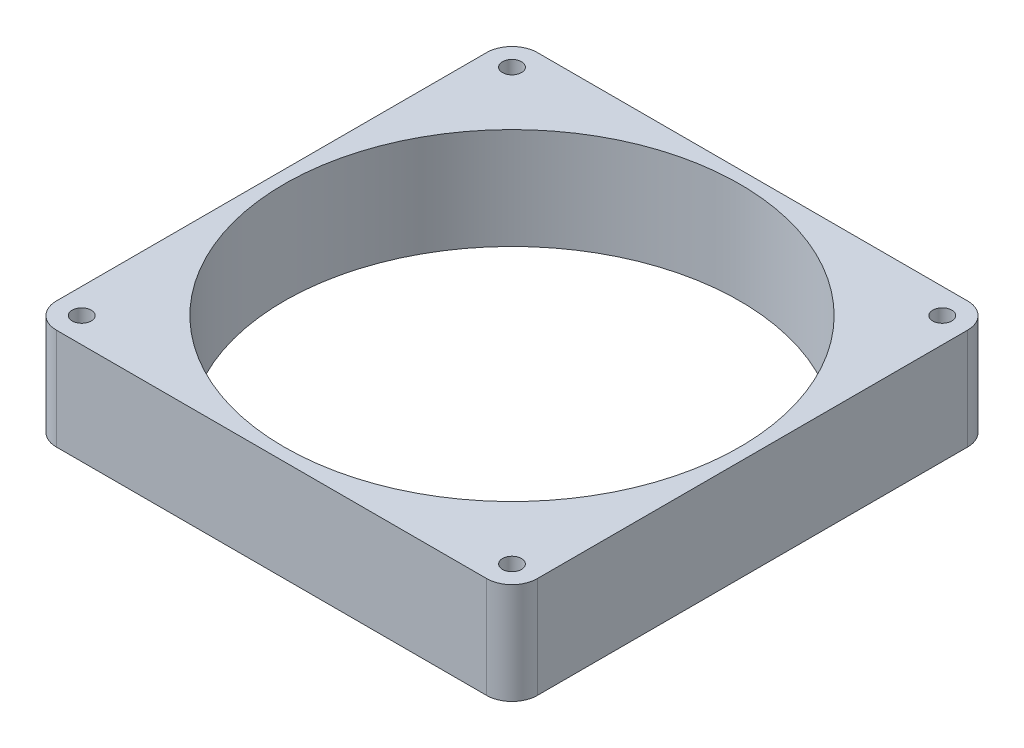
ISO-10303-21;
HEADER;
FILE_DESCRIPTION(('STEP AP214'),'2;1');
FILE_NAME('part.step','',(''),(''),'','','');
FILE_SCHEMA(('AUTOMOTIVE_DESIGN { 1 0 10303 214 1 1 1 1 }'));
ENDSEC;
DATA;
#1=APPLICATION_CONTEXT('core data for automotive mechanical design processes');
#2=APPLICATION_PROTOCOL_DEFINITION('international standard','automotive_design',2000,#1);
#3=PRODUCT_CONTEXT('',#1,'mechanical');
#4=PRODUCT('Part','Part','',(#3));
#5=PRODUCT_RELATED_PRODUCT_CATEGORY('part','',(#4));
#6=PRODUCT_DEFINITION_FORMATION('','',#4);
#7=PRODUCT_DEFINITION_CONTEXT('part definition',#1,'design');
#8=PRODUCT_DEFINITION('design','',#6,#7);
#9=PRODUCT_DEFINITION_SHAPE('','',#8);
#10=(LENGTH_UNIT() NAMED_UNIT(*) SI_UNIT(.MILLI.,.METRE.));
#11=(NAMED_UNIT(*) PLANE_ANGLE_UNIT() SI_UNIT($,.RADIAN.));
#12=(NAMED_UNIT(*) SI_UNIT($,.STERADIAN.) SOLID_ANGLE_UNIT());
#13=UNCERTAINTY_MEASURE_WITH_UNIT(LENGTH_MEASURE(1.E-05),#10,'distance_accuracy_value','');
#14=(GEOMETRIC_REPRESENTATION_CONTEXT(3) GLOBAL_UNCERTAINTY_ASSIGNED_CONTEXT((#13)) GLOBAL_UNIT_ASSIGNED_CONTEXT((#10,
#11,#12)) REPRESENTATION_CONTEXT('',''));
#15=CARTESIAN_POINT('',(0.,0.,0.));
#16=DIRECTION('',(0.,0.,1.));
#17=DIRECTION('',(1.,0.,0.));
#18=AXIS2_PLACEMENT_3D('',#15,#16,#17);
#19=CARTESIAN_POINT('',(-32.5911688311688,25.4,-19.8994155844156));
#20=DIRECTION('',(1.,0.,0.));
#21=DIRECTION('',(0.,0.,-1.));
#22=AXIS2_PLACEMENT_3D('',#19,#20,#21);
#23=PLANE('',#22);
#24=DIRECTION('',(0.,0.,1.));
#25=VECTOR('',#24,1.);
#26=CARTESIAN_POINT('',(-32.5911688311688,25.4,-19.8994155844156));
#27=LINE('',#26,#25);
#28=CARTESIAN_POINT('',(-32.5911688311688,25.4,-13.5494155844156));
#29=VERTEX_POINT('',#28);
#30=CARTESIAN_POINT('',(-32.5911688311688,25.4,94.4005844155844));
#31=VERTEX_POINT('',#30);
#32=EDGE_CURVE('E132',#29,#31,#27,.T.);
#33=ORIENTED_EDGE('',*,*,#32,.F.);
#34=DIRECTION('',(0.,-1.,0.));
#35=VECTOR('',#34,1.);
#36=CARTESIAN_POINT('',(-32.5911688311688,25.4,-13.5494155844156));
#37=LINE('',#36,#35);
#38=CARTESIAN_POINT('',(-32.5911688311688,0.,-13.5494155844156));
#39=VERTEX_POINT('',#38);
#40=EDGE_CURVE('E137',#29,#39,#37,.T.);
#41=ORIENTED_EDGE('',*,*,#40,.T.);
#42=DIRECTION('',(0.,0.,1.));
#43=VECTOR('',#42,1.);
#44=CARTESIAN_POINT('',(-32.5911688311688,0.,-19.8994155844156));
#45=LINE('',#44,#43);
#46=CARTESIAN_POINT('',(-32.5911688311688,0.,94.4005844155844));
#47=VERTEX_POINT('',#46);
#48=EDGE_CURVE('E123',#39,#47,#45,.T.);
#49=ORIENTED_EDGE('',*,*,#48,.T.);
#50=DIRECTION('',(0.,-1.,0.));
#51=VECTOR('',#50,1.);
#52=CARTESIAN_POINT('',(-32.5911688311688,25.4,94.4005844155844));
#53=LINE('',#52,#51);
#54=EDGE_CURVE('E105',#47,#31,#53,.F.);
#55=ORIENTED_EDGE('',*,*,#54,.T.);
#56=EDGE_LOOP('',(#33,#41,#49,#55));
#57=FACE_BOUND('',#56,.T.);
#58=ADVANCED_FACE('F33',(#57),#23,.F.);
#59=CARTESIAN_POINT('',(-32.5911688311688,25.4,100.750584415584));
#60=DIRECTION('',(0.,0.,-1.));
#61=DIRECTION('',(-1.,0.,0.));
#62=AXIS2_PLACEMENT_3D('',#59,#60,#61);
#63=PLANE('',#62);
#64=DIRECTION('',(1.,0.,0.));
#65=VECTOR('',#64,1.);
#66=CARTESIAN_POINT('',(-32.5911688311688,0.,100.750584415584));
#67=LINE('',#66,#65);
#68=CARTESIAN_POINT('',(-26.2411688311688,0.,100.750584415584));
#69=VERTEX_POINT('',#68);
#70=CARTESIAN_POINT('',(81.7088311688312,0.,100.750584415584));
#71=VERTEX_POINT('',#70);
#72=EDGE_CURVE('E114',#69,#71,#67,.T.);
#73=ORIENTED_EDGE('',*,*,#72,.T.);
#74=DIRECTION('',(0.,-1.,0.));
#75=VECTOR('',#74,1.);
#76=CARTESIAN_POINT('',(81.7088311688312,25.4,100.750584415584));
#77=LINE('',#76,#75);
#78=CARTESIAN_POINT('',(81.7088311688312,25.4,100.750584415584));
#79=VERTEX_POINT('',#78);
#80=EDGE_CURVE('E11',#71,#79,#77,.F.);
#81=ORIENTED_EDGE('',*,*,#80,.T.);
#82=DIRECTION('',(1.,0.,0.));
#83=VECTOR('',#82,1.);
#84=CARTESIAN_POINT('',(-32.5911688311688,25.4,100.750584415584));
#85=LINE('',#84,#83);
#86=CARTESIAN_POINT('',(-26.2411688311688,25.4,100.750584415584));
#87=VERTEX_POINT('',#86);
#88=EDGE_CURVE('E116',#87,#79,#85,.T.);
#89=ORIENTED_EDGE('',*,*,#88,.F.);
#90=DIRECTION('',(0.,-1.,0.));
#91=VECTOR('',#90,1.);
#92=CARTESIAN_POINT('',(-26.2411688311688,25.4,100.750584415584));
#93=LINE('',#92,#91);
#94=EDGE_CURVE('E103',#87,#69,#93,.T.);
#95=ORIENTED_EDGE('',*,*,#94,.T.);
#96=EDGE_LOOP('',(#73,#81,#89,#95));
#97=FACE_BOUND('',#96,.T.);
#98=ADVANCED_FACE('F113',(#97),#63,.F.);
#99=CARTESIAN_POINT('',(88.0588311688312,25.4,-19.8994155844156));
#100=DIRECTION('',(-1.,0.,0.));
#101=DIRECTION('',(0.,0.,1.));
#102=AXIS2_PLACEMENT_3D('',#99,#100,#101);
#103=PLANE('',#102);
#104=DIRECTION('',(0.,0.,-1.));
#105=VECTOR('',#104,1.);
#106=CARTESIAN_POINT('',(88.0588311688312,0.,-19.8994155844156));
#107=LINE('',#106,#105);
#108=CARTESIAN_POINT('',(88.0588311688312,0.,94.4005844155844));
#109=VERTEX_POINT('',#108);
#110=CARTESIAN_POINT('',(88.0588311688312,0.,-13.5494155844156));
#111=VERTEX_POINT('',#110);
#112=EDGE_CURVE('E122',#109,#111,#107,.T.);
#113=ORIENTED_EDGE('',*,*,#112,.T.);
#114=DIRECTION('',(0.,-1.,0.));
#115=VECTOR('',#114,1.);
#116=CARTESIAN_POINT('',(88.0588311688312,25.4,-13.5494155844156));
#117=LINE('',#116,#115);
#118=CARTESIAN_POINT('',(88.0588311688312,25.4,-13.5494155844156));
#119=VERTEX_POINT('',#118);
#120=EDGE_CURVE('E41',#111,#119,#117,.F.);
#121=ORIENTED_EDGE('',*,*,#120,.T.);
#122=DIRECTION('',(0.,0.,-1.));
#123=VECTOR('',#122,1.);
#124=CARTESIAN_POINT('',(88.0588311688312,25.4,-19.8994155844156));
#125=LINE('',#124,#123);
#126=CARTESIAN_POINT('',(88.0588311688312,25.4,94.4005844155844));
#127=VERTEX_POINT('',#126);
#128=EDGE_CURVE('E159',#127,#119,#125,.T.);
#129=ORIENTED_EDGE('',*,*,#128,.F.);
#130=DIRECTION('',(0.,-1.,0.));
#131=VECTOR('',#130,1.);
#132=CARTESIAN_POINT('',(88.0588311688312,25.4,94.4005844155844));
#133=LINE('',#132,#131);
#134=EDGE_CURVE('E155',#127,#109,#133,.T.);
#135=ORIENTED_EDGE('',*,*,#134,.T.);
#136=EDGE_LOOP('',(#113,#121,#129,#135));
#137=FACE_BOUND('',#136,.T.);
#138=ADVANCED_FACE('F158',(#137),#103,.F.);
#139=CARTESIAN_POINT('',(-32.5911688311688,25.4,-19.8994155844156));
#140=DIRECTION('',(0.,0.,1.));
#141=DIRECTION('',(1.,0.,0.));
#142=AXIS2_PLACEMENT_3D('',#139,#140,#141);
#143=PLANE('',#142);
#144=DIRECTION('',(-1.,0.,0.));
#145=VECTOR('',#144,1.);
#146=CARTESIAN_POINT('',(-32.5911688311688,0.,-19.8994155844156));
#147=LINE('',#146,#145);
#148=CARTESIAN_POINT('',(81.7088311688312,0.,-19.8994155844156));
#149=VERTEX_POINT('',#148);
#150=CARTESIAN_POINT('',(-26.2411688311688,0.,-19.8994155844156));
#151=VERTEX_POINT('',#150);
#152=EDGE_CURVE('E125',#149,#151,#147,.T.);
#153=ORIENTED_EDGE('',*,*,#152,.T.);
#154=DIRECTION('',(0.,-1.,0.));
#155=VECTOR('',#154,1.);
#156=CARTESIAN_POINT('',(-26.2411688311688,25.4,-19.8994155844156));
#157=LINE('',#156,#155);
#158=CARTESIAN_POINT('',(-26.2411688311688,25.4,-19.8994155844156));
#159=VERTEX_POINT('',#158);
#160=EDGE_CURVE('E148',#151,#159,#157,.F.);
#161=ORIENTED_EDGE('',*,*,#160,.T.);
#162=DIRECTION('',(-1.,0.,0.));
#163=VECTOR('',#162,1.);
#164=CARTESIAN_POINT('',(-32.5911688311688,25.4,-19.8994155844156));
#165=LINE('',#164,#163);
#166=CARTESIAN_POINT('',(81.7088311688312,25.4,-19.8994155844156));
#167=VERTEX_POINT('',#166);
#168=EDGE_CURVE('E117',#167,#159,#165,.T.);
#169=ORIENTED_EDGE('',*,*,#168,.F.);
#170=DIRECTION('',(0.,-1.,0.));
#171=VECTOR('',#170,1.);
#172=CARTESIAN_POINT('',(81.7088311688312,25.4,-19.8994155844156));
#173=LINE('',#172,#171);
#174=EDGE_CURVE('E145',#167,#149,#173,.T.);
#175=ORIENTED_EDGE('',*,*,#174,.T.);
#176=EDGE_LOOP('',(#153,#161,#169,#175));
#177=FACE_BOUND('',#176,.T.);
#178=ADVANCED_FACE('F168',(#177),#143,.F.);
#179=CARTESIAN_POINT('',(0.,25.4,0.));
#180=DIRECTION('',(0.,1.,0.));
#181=DIRECTION('',(0.,0.,1.));
#182=AXIS2_PLACEMENT_3D('',#179,#180,#181);
#183=PLANE('',#182);
#184=CARTESIAN_POINT('',(27.7338311688312,25.4,40.4255844155844));
#185=DIRECTION('',(0.,1.,0.));
#186=DIRECTION('',(0.,0.,1.));
#187=AXIS2_PLACEMENT_3D('',#184,#185,#186);
#188=CIRCLE('',#187,57.15);
#189=CARTESIAN_POINT('',(27.7338311688312,25.4,97.5755844155844));
#190=VERTEX_POINT('',#189);
#191=EDGE_CURVE('E200',#190,#190,#188,.T.);
#192=ORIENTED_EDGE('',*,*,#191,.F.);
#193=EDGE_LOOP('',(#192));
#194=FACE_BOUND('',#193,.T.);
#195=CARTESIAN_POINT('',(81.7088311688312,25.4,94.4005844155844));
#196=DIRECTION('',(0.,1.,0.));
#197=DIRECTION('',(0.,0.,1.));
#198=AXIS2_PLACEMENT_3D('',#195,#196,#197);
#199=CIRCLE('',#198,2.38125);
#200=CARTESIAN_POINT('',(81.7088311688312,25.4,96.7818344155844));
#201=VERTEX_POINT('',#200);
#202=EDGE_CURVE('E182',#201,#201,#199,.T.);
#203=ORIENTED_EDGE('',*,*,#202,.F.);
#204=EDGE_LOOP('',(#203));
#205=FACE_BOUND('',#204,.T.);
#206=CARTESIAN_POINT('',(81.7088311688312,25.4,-13.5494155844156));
#207=DIRECTION('',(0.,1.,0.));
#208=DIRECTION('',(0.,0.,1.));
#209=AXIS2_PLACEMENT_3D('',#206,#207,#208);
#210=CIRCLE('',#209,2.38125000000001);
#211=CARTESIAN_POINT('',(81.7088311688312,25.4,-11.1681655844156));
#212=VERTEX_POINT('',#211);
#213=EDGE_CURVE('E189',#212,#212,#210,.T.);
#214=ORIENTED_EDGE('',*,*,#213,.F.);
#215=EDGE_LOOP('',(#214));
#216=FACE_BOUND('',#215,.T.);
#217=CARTESIAN_POINT('',(-26.2411688311688,25.4,-13.5494155844156));
#218=DIRECTION('',(0.,1.,0.));
#219=DIRECTION('',(0.,0.,1.));
#220=AXIS2_PLACEMENT_3D('',#217,#218,#219);
#221=CIRCLE('',#220,2.38125);
#222=CARTESIAN_POINT('',(-26.2411688311688,25.4,-11.1681655844156));
#223=VERTEX_POINT('',#222);
#224=EDGE_CURVE('E195',#223,#223,#221,.T.);
#225=ORIENTED_EDGE('',*,*,#224,.F.);
#226=EDGE_LOOP('',(#225));
#227=FACE_BOUND('',#226,.T.);
#228=CARTESIAN_POINT('',(-26.2411688311688,25.4,94.4005844155844));
#229=DIRECTION('',(0.,1.,0.));
#230=DIRECTION('',(0.,0.,1.));
#231=AXIS2_PLACEMENT_3D('',#228,#229,#230);
#232=CIRCLE('',#231,2.38125);
#233=CARTESIAN_POINT('',(-26.2411688311688,25.4,96.7818344155844));
#234=VERTEX_POINT('',#233);
#235=EDGE_CURVE('E176',#234,#234,#232,.T.);
#236=ORIENTED_EDGE('',*,*,#235,.F.);
#237=EDGE_LOOP('',(#236));
#238=FACE_BOUND('',#237,.T.);
#239=ORIENTED_EDGE('',*,*,#168,.T.);
#240=CARTESIAN_POINT('',(-26.2411688311688,25.4,-13.5494155844156));
#241=DIRECTION('',(0.,1.,0.));
#242=DIRECTION('',(0.,0.,1.));
#243=AXIS2_PLACEMENT_3D('',#240,#241,#242);
#244=CIRCLE('',#243,6.35);
#245=EDGE_CURVE('E153',#159,#29,#244,.T.);
#246=ORIENTED_EDGE('',*,*,#245,.T.);
#247=ORIENTED_EDGE('',*,*,#32,.T.);
#248=CARTESIAN_POINT('',(-26.2411688311688,25.4,94.4005844155844));
#249=DIRECTION('',(0.,1.,0.));
#250=DIRECTION('',(0.,0.,1.));
#251=AXIS2_PLACEMENT_3D('',#248,#249,#250);
#252=CIRCLE('',#251,6.35);
#253=EDGE_CURVE('E135',#31,#87,#252,.T.);
#254=ORIENTED_EDGE('',*,*,#253,.T.);
#255=ORIENTED_EDGE('',*,*,#88,.T.);
#256=CARTESIAN_POINT('',(81.7088311688312,25.4,94.4005844155844));
#257=DIRECTION('',(0.,1.,0.));
#258=DIRECTION('',(0.,0.,1.));
#259=AXIS2_PLACEMENT_3D('',#256,#257,#258);
#260=CIRCLE('',#259,6.35);
#261=EDGE_CURVE('E54',#79,#127,#260,.T.);
#262=ORIENTED_EDGE('',*,*,#261,.T.);
#263=ORIENTED_EDGE('',*,*,#128,.T.);
#264=CARTESIAN_POINT('',(81.7088311688312,25.4,-13.5494155844156));
#265=DIRECTION('',(0.,1.,0.));
#266=DIRECTION('',(0.,0.,1.));
#267=AXIS2_PLACEMENT_3D('',#264,#265,#266);
#268=CIRCLE('',#267,6.35);
#269=EDGE_CURVE('E151',#119,#167,#268,.T.);
#270=ORIENTED_EDGE('',*,*,#269,.T.);
#271=EDGE_LOOP('',(#239,#246,#247,#254,#255,#262,#263,#270));
#272=FACE_BOUND('',#271,.T.);
#273=ADVANCED_FACE('F215',(#194,#205,#216,#227,#238,#272),#183,.T.);
#274=CARTESIAN_POINT('',(0.,0.,0.));
#275=DIRECTION('',(0.,1.,0.));
#276=DIRECTION('',(0.,0.,1.));
#277=AXIS2_PLACEMENT_3D('',#274,#275,#276);
#278=PLANE('',#277);
#279=CARTESIAN_POINT('',(27.7338311688312,0.,40.4255844155844));
#280=DIRECTION('',(0.,1.,0.));
#281=DIRECTION('',(0.,0.,1.));
#282=AXIS2_PLACEMENT_3D('',#279,#280,#281);
#283=CIRCLE('',#282,57.15);
#284=CARTESIAN_POINT('',(27.7338311688312,0.,97.5755844155844));
#285=VERTEX_POINT('',#284);
#286=EDGE_CURVE('E186',#285,#285,#283,.T.);
#287=ORIENTED_EDGE('',*,*,#286,.T.);
#288=EDGE_LOOP('',(#287));
#289=FACE_BOUND('',#288,.T.);
#290=CARTESIAN_POINT('',(81.7088311688312,0.,94.4005844155844));
#291=DIRECTION('',(0.,1.,0.));
#292=DIRECTION('',(0.,0.,1.));
#293=AXIS2_PLACEMENT_3D('',#290,#291,#292);
#294=CIRCLE('',#293,2.38125);
#295=CARTESIAN_POINT('',(81.7088311688312,0.,96.7818344155844));
#296=VERTEX_POINT('',#295);
#297=EDGE_CURVE('E185',#296,#296,#294,.T.);
#298=ORIENTED_EDGE('',*,*,#297,.T.);
#299=EDGE_LOOP('',(#298));
#300=FACE_BOUND('',#299,.T.);
#301=CARTESIAN_POINT('',(81.7088311688312,0.,-13.5494155844156));
#302=DIRECTION('',(0.,1.,0.));
#303=DIRECTION('',(0.,0.,1.));
#304=AXIS2_PLACEMENT_3D('',#301,#302,#303);
#305=CIRCLE('',#304,2.38125000000001);
#306=CARTESIAN_POINT('',(81.7088311688312,0.,-11.1681655844156));
#307=VERTEX_POINT('',#306);
#308=EDGE_CURVE('E192',#307,#307,#305,.T.);
#309=ORIENTED_EDGE('',*,*,#308,.T.);
#310=EDGE_LOOP('',(#309));
#311=FACE_BOUND('',#310,.T.);
#312=CARTESIAN_POINT('',(-26.2411688311688,0.,-13.5494155844156));
#313=DIRECTION('',(0.,1.,0.));
#314=DIRECTION('',(0.,0.,1.));
#315=AXIS2_PLACEMENT_3D('',#312,#313,#314);
#316=CIRCLE('',#315,2.38125);
#317=CARTESIAN_POINT('',(-26.2411688311688,0.,-11.1681655844156));
#318=VERTEX_POINT('',#317);
#319=EDGE_CURVE('E179',#318,#318,#316,.T.);
#320=ORIENTED_EDGE('',*,*,#319,.T.);
#321=EDGE_LOOP('',(#320));
#322=FACE_BOUND('',#321,.T.);
#323=CARTESIAN_POINT('',(-26.2411688311688,0.,94.4005844155844));
#324=DIRECTION('',(0.,1.,0.));
#325=DIRECTION('',(0.,0.,1.));
#326=AXIS2_PLACEMENT_3D('',#323,#324,#325);
#327=CIRCLE('',#326,2.38125);
#328=CARTESIAN_POINT('',(-26.2411688311688,0.,96.7818344155844));
#329=VERTEX_POINT('',#328);
#330=EDGE_CURVE('E127',#329,#329,#327,.T.);
#331=ORIENTED_EDGE('',*,*,#330,.T.);
#332=EDGE_LOOP('',(#331));
#333=FACE_BOUND('',#332,.T.);
#334=ORIENTED_EDGE('',*,*,#48,.F.);
#335=CARTESIAN_POINT('',(-26.2411688311688,0.,-13.5494155844156));
#336=DIRECTION('',(0.,1.,0.));
#337=DIRECTION('',(0.,0.,1.));
#338=AXIS2_PLACEMENT_3D('',#335,#336,#337);
#339=CIRCLE('',#338,6.35);
#340=EDGE_CURVE('E143',#39,#151,#339,.F.);
#341=ORIENTED_EDGE('',*,*,#340,.T.);
#342=ORIENTED_EDGE('',*,*,#152,.F.);
#343=CARTESIAN_POINT('',(81.7088311688312,0.,-13.5494155844156));
#344=DIRECTION('',(0.,1.,0.));
#345=DIRECTION('',(0.,0.,1.));
#346=AXIS2_PLACEMENT_3D('',#343,#344,#345);
#347=CIRCLE('',#346,6.35);
#348=EDGE_CURVE('E141',#149,#111,#347,.F.);
#349=ORIENTED_EDGE('',*,*,#348,.T.);
#350=ORIENTED_EDGE('',*,*,#112,.F.);
#351=CARTESIAN_POINT('',(81.7088311688312,0.,94.4005844155844));
#352=DIRECTION('',(0.,1.,0.));
#353=DIRECTION('',(0.,0.,1.));
#354=AXIS2_PLACEMENT_3D('',#351,#352,#353);
#355=CIRCLE('',#354,6.35);
#356=EDGE_CURVE('E121',#109,#71,#355,.F.);
#357=ORIENTED_EDGE('',*,*,#356,.T.);
#358=ORIENTED_EDGE('',*,*,#72,.F.);
#359=CARTESIAN_POINT('',(-26.2411688311688,0.,94.4005844155844));
#360=DIRECTION('',(0.,1.,0.));
#361=DIRECTION('',(0.,0.,1.));
#362=AXIS2_PLACEMENT_3D('',#359,#360,#361);
#363=CIRCLE('',#362,6.35);
#364=EDGE_CURVE('E99',#69,#47,#363,.F.);
#365=ORIENTED_EDGE('',*,*,#364,.T.);
#366=EDGE_LOOP('',(#334,#341,#342,#349,#350,#357,#358,#365));
#367=FACE_BOUND('',#366,.T.);
#368=ADVANCED_FACE('F119',(#289,#300,#311,#322,#333,#367),#278,.F.);
#369=CARTESIAN_POINT('',(-26.2411688311688,25.4,94.4005844155844));
#370=DIRECTION('',(0.,-1.,0.));
#371=DIRECTION('',(0.,0.,-1.));
#372=AXIS2_PLACEMENT_3D('',#369,#370,#371);
#373=CYLINDRICAL_SURFACE('',#372,6.35);
#374=ORIENTED_EDGE('',*,*,#253,.F.);
#375=ORIENTED_EDGE('',*,*,#54,.F.);
#376=ORIENTED_EDGE('',*,*,#364,.F.);
#377=ORIENTED_EDGE('',*,*,#94,.F.);
#378=EDGE_LOOP('',(#374,#375,#376,#377));
#379=FACE_BOUND('',#378,.T.);
#380=ADVANCED_FACE('F102',(#379),#373,.T.);
#381=CARTESIAN_POINT('',(-26.2411688311688,25.4,-13.5494155844156));
#382=DIRECTION('',(0.,-1.,0.));
#383=DIRECTION('',(0.,0.,-1.));
#384=AXIS2_PLACEMENT_3D('',#381,#382,#383);
#385=CYLINDRICAL_SURFACE('',#384,6.35);
#386=ORIENTED_EDGE('',*,*,#245,.F.);
#387=ORIENTED_EDGE('',*,*,#160,.F.);
#388=ORIENTED_EDGE('',*,*,#340,.F.);
#389=ORIENTED_EDGE('',*,*,#40,.F.);
#390=EDGE_LOOP('',(#386,#387,#388,#389));
#391=FACE_BOUND('',#390,.T.);
#392=ADVANCED_FACE('F253',(#391),#385,.T.);
#393=CARTESIAN_POINT('',(81.7088311688312,25.4,-13.5494155844156));
#394=DIRECTION('',(0.,-1.,0.));
#395=DIRECTION('',(0.,0.,-1.));
#396=AXIS2_PLACEMENT_3D('',#393,#394,#395);
#397=CYLINDRICAL_SURFACE('',#396,6.35);
#398=ORIENTED_EDGE('',*,*,#269,.F.);
#399=ORIENTED_EDGE('',*,*,#120,.F.);
#400=ORIENTED_EDGE('',*,*,#348,.F.);
#401=ORIENTED_EDGE('',*,*,#174,.F.);
#402=EDGE_LOOP('',(#398,#399,#400,#401));
#403=FACE_BOUND('',#402,.T.);
#404=ADVANCED_FACE('F165',(#403),#397,.T.);
#405=CARTESIAN_POINT('',(81.7088311688312,25.4,94.4005844155844));
#406=DIRECTION('',(0.,-1.,0.));
#407=DIRECTION('',(0.,0.,-1.));
#408=AXIS2_PLACEMENT_3D('',#405,#406,#407);
#409=CYLINDRICAL_SURFACE('',#408,6.35);
#410=ORIENTED_EDGE('',*,*,#261,.F.);
#411=ORIENTED_EDGE('',*,*,#80,.F.);
#412=ORIENTED_EDGE('',*,*,#356,.F.);
#413=ORIENTED_EDGE('',*,*,#134,.F.);
#414=EDGE_LOOP('',(#410,#411,#412,#413));
#415=FACE_BOUND('',#414,.T.);
#416=ADVANCED_FACE('F35',(#415),#409,.T.);
#417=CARTESIAN_POINT('',(-26.2411688311688,0.,94.4005844155844));
#418=DIRECTION('',(0.,1.,0.));
#419=DIRECTION('',(0.,0.,1.));
#420=AXIS2_PLACEMENT_3D('',#417,#418,#419);
#421=CYLINDRICAL_SURFACE('',#420,2.38125);
#422=ORIENTED_EDGE('',*,*,#330,.F.);
#423=EDGE_LOOP('',(#422));
#424=FACE_BOUND('',#423,.T.);
#425=ORIENTED_EDGE('',*,*,#235,.T.);
#426=EDGE_LOOP('',(#425));
#427=FACE_BOUND('',#426,.T.);
#428=ADVANCED_FACE('F227',(#424,#427),#421,.F.);
#429=CARTESIAN_POINT('',(-26.2411688311688,0.,-13.5494155844156));
#430=DIRECTION('',(0.,1.,0.));
#431=DIRECTION('',(0.,0.,1.));
#432=AXIS2_PLACEMENT_3D('',#429,#430,#431);
#433=CYLINDRICAL_SURFACE('',#432,2.38125);
#434=ORIENTED_EDGE('',*,*,#319,.F.);
#435=EDGE_LOOP('',(#434));
#436=FACE_BOUND('',#435,.T.);
#437=ORIENTED_EDGE('',*,*,#224,.T.);
#438=EDGE_LOOP('',(#437));
#439=FACE_BOUND('',#438,.T.);
#440=ADVANCED_FACE('F229',(#436,#439),#433,.F.);
#441=CARTESIAN_POINT('',(81.7088311688312,0.,-13.5494155844156));
#442=DIRECTION('',(0.,1.,0.));
#443=DIRECTION('',(0.,0.,1.));
#444=AXIS2_PLACEMENT_3D('',#441,#442,#443);
#445=CYLINDRICAL_SURFACE('',#444,2.38125000000001);
#446=ORIENTED_EDGE('',*,*,#308,.F.);
#447=EDGE_LOOP('',(#446));
#448=FACE_BOUND('',#447,.T.);
#449=ORIENTED_EDGE('',*,*,#213,.T.);
#450=EDGE_LOOP('',(#449));
#451=FACE_BOUND('',#450,.T.);
#452=ADVANCED_FACE('F236',(#448,#451),#445,.F.);
#453=CARTESIAN_POINT('',(81.7088311688312,0.,94.4005844155844));
#454=DIRECTION('',(0.,1.,0.));
#455=DIRECTION('',(0.,0.,1.));
#456=AXIS2_PLACEMENT_3D('',#453,#454,#455);
#457=CYLINDRICAL_SURFACE('',#456,2.38125);
#458=ORIENTED_EDGE('',*,*,#297,.F.);
#459=EDGE_LOOP('',(#458));
#460=FACE_BOUND('',#459,.T.);
#461=ORIENTED_EDGE('',*,*,#202,.T.);
#462=EDGE_LOOP('',(#461));
#463=FACE_BOUND('',#462,.T.);
#464=ADVANCED_FACE('F211',(#460,#463),#457,.F.);
#465=CARTESIAN_POINT('',(27.7338311688312,0.,40.4255844155844));
#466=DIRECTION('',(0.,1.,0.));
#467=DIRECTION('',(0.,0.,1.));
#468=AXIS2_PLACEMENT_3D('',#465,#466,#467);
#469=CYLINDRICAL_SURFACE('',#468,57.15);
#470=ORIENTED_EDGE('',*,*,#286,.F.);
#471=EDGE_LOOP('',(#470));
#472=FACE_BOUND('',#471,.T.);
#473=ORIENTED_EDGE('',*,*,#191,.T.);
#474=EDGE_LOOP('',(#473));
#475=FACE_BOUND('',#474,.T.);
#476=ADVANCED_FACE('F208',(#472,#475),#469,.F.);
#477=CLOSED_SHELL('',(#58,#98,#138,#178,#273,#368,#380,#392,#404,#416,#428,#440,#452,#464,#476));
#478=MANIFOLD_SOLID_BREP('B2',#477);
#479=ADVANCED_BREP_SHAPE_REPRESENTATION('',(#18,#478),#14);
#480=SHAPE_DEFINITION_REPRESENTATION(#9,#479);
ENDSEC;
END-ISO-10303-21;
